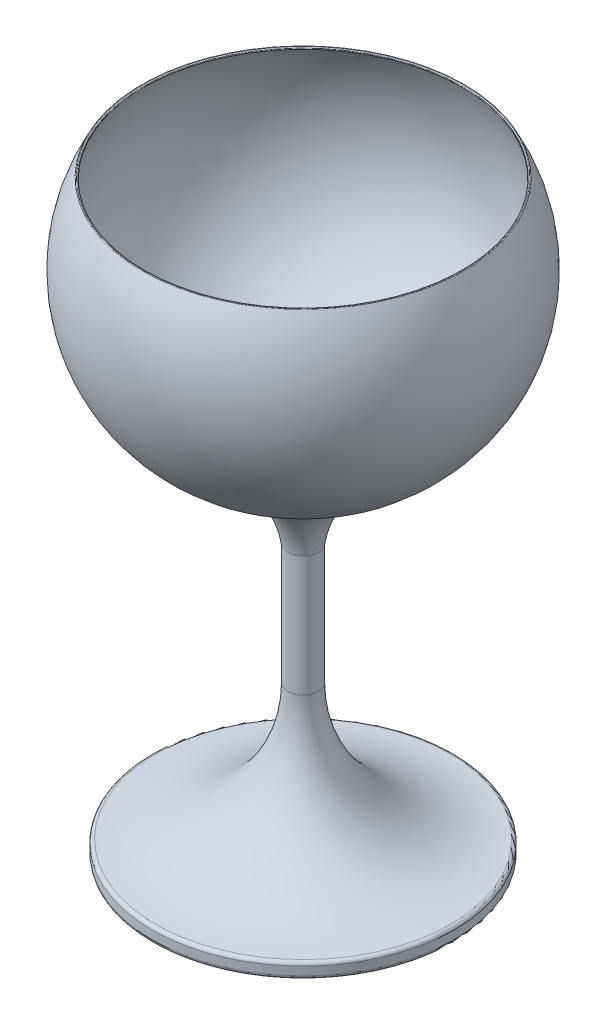
ISO-10303-21;
HEADER;
FILE_DESCRIPTION(('STEP AP214'),'2;1');
FILE_NAME('part.step','',(''),(''),'','','');
FILE_SCHEMA(('AUTOMOTIVE_DESIGN { 1 0 10303 214 1 1 1 1 }'));
ENDSEC;
DATA;
#1=APPLICATION_CONTEXT('core data for automotive mechanical design processes');
#2=APPLICATION_PROTOCOL_DEFINITION('international standard','automotive_design',2000,#1);
#3=PRODUCT_CONTEXT('',#1,'mechanical');
#4=PRODUCT('Part','Part','',(#3));
#5=PRODUCT_RELATED_PRODUCT_CATEGORY('part','',(#4));
#6=PRODUCT_DEFINITION_FORMATION('','',#4);
#7=PRODUCT_DEFINITION_CONTEXT('part definition',#1,'design');
#8=PRODUCT_DEFINITION('design','',#6,#7);
#9=PRODUCT_DEFINITION_SHAPE('','',#8);
#10=(LENGTH_UNIT() NAMED_UNIT(*) SI_UNIT(.MILLI.,.METRE.));
#11=(NAMED_UNIT(*) PLANE_ANGLE_UNIT() SI_UNIT($,.RADIAN.));
#12=(NAMED_UNIT(*) SI_UNIT($,.STERADIAN.) SOLID_ANGLE_UNIT());
#13=UNCERTAINTY_MEASURE_WITH_UNIT(LENGTH_MEASURE(1.E-05),#10,'distance_accuracy_value','');
#14=(GEOMETRIC_REPRESENTATION_CONTEXT(3) GLOBAL_UNCERTAINTY_ASSIGNED_CONTEXT((#13)) GLOBAL_UNIT_ASSIGNED_CONTEXT((#10,
#11,#12)) REPRESENTATION_CONTEXT('',''));
#15=CARTESIAN_POINT('',(0.,0.,0.));
#16=DIRECTION('',(0.,0.,1.));
#17=DIRECTION('',(1.,0.,0.));
#18=AXIS2_PLACEMENT_3D('',#15,#16,#17);
#19=CARTESIAN_POINT('',(0.,-112.912710017662,0.));
#20=DIRECTION('',(0.,-1.,0.));
#21=DIRECTION('',(0.,0.,-1.));
#22=AXIS2_PLACEMENT_3D('',#19,#20,#21);
#23=TOROIDAL_SURFACE('',#22,44.5,40.);
#24=CARTESIAN_POINT('',(0.,-112.912710017662,0.));
#25=DIRECTION('',(0.,-1.,0.));
#26=DIRECTION('',(0.,0.,-1.));
#27=AXIS2_PLACEMENT_3D('',#24,#25,#26);
#28=CIRCLE('',#27,4.5);
#29=CARTESIAN_POINT('',(0.,-112.912710017662,-4.5));
#30=VERTEX_POINT('',#29);
#31=EDGE_CURVE('E11',#30,#30,#28,.T.);
#32=ORIENTED_EDGE('',*,*,#31,.T.);
#33=EDGE_LOOP('',(#32));
#34=FACE_BOUND('',#33,.T.);
#35=CARTESIAN_POINT('',(0.,-152.900810567748,0.));
#36=DIRECTION('',(0.,-1.,0.));
#37=DIRECTION('',(0.,0.,-1.));
#38=AXIS2_PLACEMENT_3D('',#35,#36,#37);
#39=CIRCLE('',#38,43.5243902439024);
#40=CARTESIAN_POINT('',(0.,-152.900810567748,-43.5243902439024));
#41=VERTEX_POINT('',#40);
#42=EDGE_CURVE('E132',#41,#41,#39,.T.);
#43=ORIENTED_EDGE('',*,*,#42,.F.);
#44=EDGE_LOOP('',(#43));
#45=FACE_BOUND('',#44,.T.);
#46=ADVANCED_FACE('F41',(#34,#45),#23,.F.);
#47=CARTESIAN_POINT('',(0.,-162.570284158374,0.));
#48=DIRECTION('',(0.,-1.,0.));
#49=DIRECTION('',(0.,0.,-1.));
#50=AXIS2_PLACEMENT_3D('',#47,#48,#49);
#51=CYLINDRICAL_SURFACE('',#50,4.5);
#52=CARTESIAN_POINT('',(0.,-77.4005130815004,0.));
#53=DIRECTION('',(0.,-1.,0.));
#54=DIRECTION('',(0.,0.,-1.));
#55=AXIS2_PLACEMENT_3D('',#52,#53,#54);
#56=CIRCLE('',#55,4.49999999999999);
#57=CARTESIAN_POINT('',(0.,-77.4005130815004,-4.49999999999999));
#58=VERTEX_POINT('',#57);
#59=EDGE_CURVE('E49',#58,#58,#56,.T.);
#60=ORIENTED_EDGE('',*,*,#59,.T.);
#61=EDGE_LOOP('',(#60));
#62=FACE_BOUND('',#61,.T.);
#63=ORIENTED_EDGE('',*,*,#31,.F.);
#64=EDGE_LOOP('',(#63));
#65=FACE_BOUND('',#64,.T.);
#66=ADVANCED_FACE('F109',(#62,#65),#51,.T.);
#67=CARTESIAN_POINT('',(0.,-81.2935701157988,0.));
#68=DIRECTION('',(0.,-1.,0.));
#69=DIRECTION('',(0.,0.,-1.));
#70=AXIS2_PLACEMENT_3D('',#67,#68,#69);
#71=TOROIDAL_SURFACE('',#70,34.2463293017424,30.);
#72=CARTESIAN_POINT('',(0.,-53.9479445443123,0.));
#73=DIRECTION('',(0.,-1.,0.));
#74=DIRECTION('',(0.,0.,-1.));
#75=AXIS2_PLACEMENT_3D('',#72,#73,#74);
#76=CIRCLE('',#75,21.9087135635188);
#77=CARTESIAN_POINT('',(0.,-53.9479445443123,-21.9087135635188));
#78=VERTEX_POINT('',#77);
#79=EDGE_CURVE('E102',#78,#78,#76,.T.);
#80=ORIENTED_EDGE('',*,*,#79,.T.);
#81=EDGE_LOOP('',(#80));
#82=FACE_BOUND('',#81,.T.);
#83=ORIENTED_EDGE('',*,*,#59,.F.);
#84=EDGE_LOOP('',(#83));
#85=FACE_BOUND('',#84,.T.);
#86=ADVANCED_FACE('F112',(#82,#85),#71,.F.);
#87=CARTESIAN_POINT('',(0.,-53.9479445443123,0.));
#88=DIRECTION('',(0.,1.,0.));
#89=DIRECTION('',(0.,0.,1.));
#90=AXIS2_PLACEMENT_3D('',#87,#88,#89);
#91=CONICAL_SURFACE('',#90,21.9087135635188,1.14696712383149);
#92=CARTESIAN_POINT('',(0.,-52.9765557006446,0.));
#93=DIRECTION('',(0.,-1.,0.));
#94=DIRECTION('',(0.,0.,-1.));
#95=AXIS2_PLACEMENT_3D('',#92,#93,#94);
#96=CIRCLE('',#95,24.0617418444175);
#97=CARTESIAN_POINT('',(0.,-52.9765557006446,-24.0617418444175));
#98=VERTEX_POINT('',#97);
#99=EDGE_CURVE('E98',#98,#98,#96,.T.);
#100=ORIENTED_EDGE('',*,*,#99,.T.);
#101=EDGE_LOOP('',(#100));
#102=FACE_BOUND('',#101,.T.);
#103=ORIENTED_EDGE('',*,*,#79,.F.);
#104=EDGE_LOOP('',(#103));
#105=FACE_BOUND('',#104,.T.);
#106=ADVANCED_FACE('F114',(#102,#105),#91,.T.);
#107=CARTESIAN_POINT('',(0.,-7.40051308150044,0.));
#108=DIRECTION('',(0.,-1.,0.));
#109=DIRECTION('',(0.,0.,-1.));
#110=AXIS2_PLACEMENT_3D('',#107,#108,#109);
#111=DEGENERATE_TOROIDAL_SURFACE('',#110,3.499048947378,50.,.T.);
#112=CARTESIAN_POINT('',(0.,16.1695068084972,0.));
#113=DIRECTION('',(0.,-1.,0.));
#114=DIRECTION('',(0.,0.,-1.));
#115=AXIS2_PLACEMENT_3D('',#112,#113,#114);
#116=CIRCLE('',#115,47.5950143227399);
#117=CARTESIAN_POINT('',(0.,16.1695068084972,-47.5950143227399));
#118=VERTEX_POINT('',#117);
#119=EDGE_CURVE('E94',#118,#118,#116,.T.);
#120=ORIENTED_EDGE('',*,*,#119,.T.);
#121=EDGE_LOOP('',(#120));
#122=FACE_BOUND('',#121,.T.);
#123=ORIENTED_EDGE('',*,*,#99,.F.);
#124=EDGE_LOOP('',(#123));
#125=FACE_BOUND('',#124,.T.);
#126=ADVANCED_FACE('F121',(#122,#125),#111,.T.);
#127=CARTESIAN_POINT('',(0.,16.0752267289372,0.));
#128=DIRECTION('',(0.,-1.,0.));
#129=DIRECTION('',(0.,0.,-1.));
#130=AXIS2_PLACEMENT_3D('',#127,#128,#129);
#131=TOROIDAL_SURFACE('',#130,47.4186304612385,0.200000000000005);
#132=CARTESIAN_POINT('',(0.,16.2512305331477,0.));
#133=DIRECTION('',(0.,-1.,0.));
#134=DIRECTION('',(0.,0.,-1.));
#135=AXIS2_PLACEMENT_3D('',#132,#133,#134);
#136=CIRCLE('',#135,47.3236427730708);
#137=CARTESIAN_POINT('',(0.,16.2512305331477,-47.3236427730708));
#138=VERTEX_POINT('',#137);
#139=EDGE_CURVE('E90',#138,#138,#136,.T.);
#140=ORIENTED_EDGE('',*,*,#139,.T.);
#141=EDGE_LOOP('',(#140));
#142=FACE_BOUND('',#141,.T.);
#143=ORIENTED_EDGE('',*,*,#119,.F.);
#144=EDGE_LOOP('',(#143));
#145=FACE_BOUND('',#144,.T.);
#146=ADVANCED_FACE('F190',(#142,#145),#131,.T.);
#147=CARTESIAN_POINT('',(0.,16.2512305331477,0.));
#148=DIRECTION('',(0.,1.,0.));
#149=DIRECTION('',(0.,0.,1.));
#150=AXIS2_PLACEMENT_3D('',#147,#148,#149);
#151=CONICAL_SURFACE('',#150,47.3236427730708,1.07590224847942);
#152=CARTESIAN_POINT('',(0.,16.0850007288194,0.));
#153=DIRECTION('',(0.,-1.,0.));
#154=DIRECTION('',(0.,0.,-1.));
#155=AXIS2_PLACEMENT_3D('',#152,#153,#154);
#156=CIRCLE('',#155,47.0156336142068);
#157=CARTESIAN_POINT('',(0.,16.0850007288194,-47.0156336142068));
#158=VERTEX_POINT('',#157);
#159=EDGE_CURVE('E86',#158,#158,#156,.T.);
#160=ORIENTED_EDGE('',*,*,#159,.T.);
#161=EDGE_LOOP('',(#160));
#162=FACE_BOUND('',#161,.T.);
#163=ORIENTED_EDGE('',*,*,#139,.F.);
#164=EDGE_LOOP('',(#163));
#165=FACE_BOUND('',#164,.T.);
#166=ADVANCED_FACE('F186',(#162,#165),#151,.F.);
#167=CARTESIAN_POINT('',(0.,15.9089969246089,0.));
#168=DIRECTION('',(0.,-1.,0.));
#169=DIRECTION('',(0.,0.,-1.));
#170=AXIS2_PLACEMENT_3D('',#167,#168,#169);
#171=TOROIDAL_SURFACE('',#170,47.1106213023745,0.200000000000004);
#172=CARTESIAN_POINT('',(0.,15.8147218588612,0.));
#173=DIRECTION('',(0.,-1.,0.));
#174=DIRECTION('',(0.,0.,-1.));
#175=AXIS2_PLACEMENT_3D('',#172,#173,#174);
#176=CIRCLE('',#175,46.9342347609994);
#177=CARTESIAN_POINT('',(0.,15.8147218588612,-46.9342347609994));
#178=VERTEX_POINT('',#177);
#179=EDGE_CURVE('E82',#178,#178,#176,.T.);
#180=ORIENTED_EDGE('',*,*,#179,.T.);
#181=EDGE_LOOP('',(#180));
#182=FACE_BOUND('',#181,.T.);
#183=ORIENTED_EDGE('',*,*,#159,.F.);
#184=EDGE_LOOP('',(#183));
#185=FACE_BOUND('',#184,.T.);
#186=ADVANCED_FACE('F182',(#182,#185),#171,.T.);
#187=CARTESIAN_POINT('',(0.,-7.40051308150044,0.));
#188=DIRECTION('',(0.,-1.,0.));
#189=DIRECTION('',(0.,0.,-1.));
#190=AXIS2_PLACEMENT_3D('',#187,#188,#189);
#191=DEGENERATE_TOROIDAL_SURFACE('',#190,3.499048947378,49.25,.T.);
#192=CARTESIAN_POINT('',(0.,-52.2929150613574,0.));
#193=DIRECTION('',(0.,-1.,0.));
#194=DIRECTION('',(0.,0.,-1.));
#195=AXIS2_PLACEMENT_3D('',#192,#193,#194);
#196=CIRCLE('',#195,23.7533014509619);
#197=CARTESIAN_POINT('',(0.,-52.2929150613574,-23.7533014509619));
#198=VERTEX_POINT('',#197);
#199=EDGE_CURVE('E72',#198,#198,#196,.T.);
#200=ORIENTED_EDGE('',*,*,#199,.T.);
#201=EDGE_LOOP('',(#200));
#202=FACE_BOUND('',#201,.T.);
#203=ORIENTED_EDGE('',*,*,#179,.F.);
#204=EDGE_LOOP('',(#203));
#205=FACE_BOUND('',#204,.T.);
#206=ADVANCED_FACE('F178',(#202,#205),#191,.F.);
#207=CARTESIAN_POINT('',(0.,-52.2929150613574,0.));
#208=DIRECTION('',(0.,1.,0.));
#209=DIRECTION('',(0.,0.,1.));
#210=AXIS2_PLACEMENT_3D('',#207,#208,#209);
#211=CONICAL_SURFACE('',#210,23.7533014509619,1.1469671238315);
#212=CARTESIAN_POINT('',(0.,-54.19085181621,0.));
#213=DIRECTION('',(0.,-1.,0.));
#214=DIRECTION('',(0.,0.,-1.));
#215=AXIS2_PLACEMENT_3D('',#212,#213,#214);
#216=CIRCLE('',#215,19.5466322729159);
#217=CARTESIAN_POINT('',(0.,-54.19085181621,-19.5466322729159));
#218=VERTEX_POINT('',#217);
#219=EDGE_CURVE('E66',#218,#218,#216,.T.);
#220=ORIENTED_EDGE('',*,*,#219,.T.);
#221=EDGE_LOOP('',(#220));
#222=FACE_BOUND('',#221,.T.);
#223=ORIENTED_EDGE('',*,*,#199,.F.);
#224=EDGE_LOOP('',(#223));
#225=FACE_BOUND('',#224,.T.);
#226=ADVANCED_FACE('F175',(#222,#225),#211,.F.);
#227=CARTESIAN_POINT('',(0.,-49.6332475542956,0.));
#228=DIRECTION('',(0.,-1.,0.));
#229=DIRECTION('',(0.,0.,-1.));
#230=AXIS2_PLACEMENT_3D('',#227,#228,#229);
#231=TOROIDAL_SURFACE('',#230,17.4903629832119,4.99999999999997);
#232=CARTESIAN_POINT('',(0.,-54.5333684649435,0.));
#233=DIRECTION('',(0.,-1.,0.));
#234=DIRECTION('',(0.,0.,-1.));
#235=AXIS2_PLACEMENT_3D('',#232,#233,#234);
#236=CIRCLE('',#235,18.4847547877995);
#237=CARTESIAN_POINT('',(0.,-54.5333684649435,-18.4847547877995));
#238=VERTEX_POINT('',#237);
#239=EDGE_CURVE('E63',#238,#238,#236,.T.);
#240=ORIENTED_EDGE('',*,*,#239,.T.);
#241=EDGE_LOOP('',(#240));
#242=FACE_BOUND('',#241,.T.);
#243=ORIENTED_EDGE('',*,*,#219,.F.);
#244=EDGE_LOOP('',(#243));
#245=FACE_BOUND('',#244,.T.);
#246=ADVANCED_FACE('F59',(#242,#245),#231,.F.);
#247=CARTESIAN_POINT('',(0.,239.473886173932,41.1787534874532));
#248=DIRECTION('',(-1.,0.,0.));
#249=DIRECTION('',(0.,0.,-1.));
#250=AXIS2_PLACEMENT_3D('',#247,#248,#249);
#251=CIRCLE('',#250,300.);
#252=TRIMMED_CURVE('',#251,(PARAMETER_VALUE(-1.43309909211471)),
(PARAMETER_VALUE(1.43309909211471)),.T.,.PARAMETER.);
#253=CARTESIAN_POINT('',(0.,239.473886173932,0.));
#254=DIRECTION('',(0.,-1.,0.));
#255=AXIS1_PLACEMENT('',#253,#254);
#256=SURFACE_OF_REVOLUTION('',#252,#255);
#257=CARTESIAN_POINT('',(-1.52655665885959E-13,-57.6865254915846,0.));
#258=VERTEX_POINT('',#257);
#259=VERTEX_LOOP('',#258);
#260=FACE_BOUND('',#259,.T.);
#261=ORIENTED_EDGE('',*,*,#239,.F.);
#262=EDGE_LOOP('',(#261));
#263=FACE_BOUND('',#262,.T.);
#264=ADVANCED_FACE('F55',(#260,#263),#256,.F.);
#265=CARTESIAN_POINT('',(0.,-353.237532739027,8.0725197055923));
#266=DIRECTION('',(-1.,0.,0.));
#267=DIRECTION('',(0.,0.,-1.));
#268=AXIS2_PLACEMENT_3D('',#265,#266,#267);
#269=CIRCLE('',#268,200.);
#270=TRIMMED_CURVE('',#269,(PARAMETER_VALUE(-1.53042276084168)),
(PARAMETER_VALUE(1.53042276084168)),.T.,.PARAMETER.);
#271=CARTESIAN_POINT('',(0.,-353.237532739027,0.));
#272=DIRECTION('',(0.,-1.,0.));
#273=AXIS1_PLACEMENT('',#271,#272);
#274=SURFACE_OF_REVOLUTION('',#270,#273);
#275=CARTESIAN_POINT('',(0.,-157.298976975586,0.));
#276=DIRECTION('',(0.,-1.,0.));
#277=DIRECTION('',(0.,0.,-1.));
#278=AXIS2_PLACEMENT_3D('',#275,#276,#277);
#279=CIRCLE('',#278,32.0283825951905);
#280=CARTESIAN_POINT('',(0.,-157.298976975586,-32.0283825951905));
#281=VERTEX_POINT('',#280);
#282=EDGE_CURVE('E67',#281,#281,#279,.T.);
#283=ORIENTED_EDGE('',*,*,#282,.T.);
#284=EDGE_LOOP('',(#283));
#285=FACE_BOUND('',#284,.T.);
#286=CARTESIAN_POINT('',(0.,-153.4005130815,0.));
#287=VERTEX_POINT('',#286);
#288=VERTEX_LOOP('',#287);
#289=FACE_BOUND('',#288,.T.);
#290=ADVANCED_FACE('F58',(#285,#289),#274,.F.);
#291=CARTESIAN_POINT('',(0.,-152.4005130815,0.));
#292=DIRECTION('',(0.,-1.,0.));
#293=DIRECTION('',(0.,0.,-1.));
#294=AXIS2_PLACEMENT_3D('',#291,#292,#293);
#295=TOROIDAL_SURFACE('',#294,33.0309051527101,5.00000000000001);
#296=CARTESIAN_POINT('',(0.,-157.4005130815,0.));
#297=DIRECTION('',(0.,-1.,0.));
#298=DIRECTION('',(0.,0.,-1.));
#299=AXIS2_PLACEMENT_3D('',#296,#297,#298);
#300=CIRCLE('',#299,33.0309051527101);
#301=CARTESIAN_POINT('',(0.,-157.4005130815,-33.0309051527101));
#302=VERTEX_POINT('',#301);
#303=EDGE_CURVE('E75',#302,#302,#300,.T.);
#304=ORIENTED_EDGE('',*,*,#303,.T.);
#305=EDGE_LOOP('',(#304));
#306=FACE_BOUND('',#305,.T.);
#307=ORIENTED_EDGE('',*,*,#282,.F.);
#308=EDGE_LOOP('',(#307));
#309=FACE_BOUND('',#308,.T.);
#310=ADVANCED_FACE('F152',(#306,#309),#295,.T.);
#311=CARTESIAN_POINT('',(43.5,-157.4005130815,0.));
#312=DIRECTION('',(0.,-1.,0.));
#313=DIRECTION('',(0.,0.,-1.));
#314=AXIS2_PLACEMENT_3D('',#311,#312,#313);
#315=PLANE('',#314);
#316=CARTESIAN_POINT('',(0.,-157.4005130815,0.));
#317=DIRECTION('',(0.,-1.,0.));
#318=DIRECTION('',(0.,0.,-1.));
#319=AXIS2_PLACEMENT_3D('',#316,#317,#318);
#320=CIRCLE('',#319,43.5);
#321=CARTESIAN_POINT('',(0.,-157.4005130815,-43.5));
#322=VERTEX_POINT('',#321);
#323=EDGE_CURVE('E145',#322,#322,#320,.T.);
#324=ORIENTED_EDGE('',*,*,#323,.T.);
#325=EDGE_LOOP('',(#324));
#326=FACE_BOUND('',#325,.T.);
#327=ORIENTED_EDGE('',*,*,#303,.F.);
#328=EDGE_LOOP('',(#327));
#329=FACE_BOUND('',#328,.T.);
#330=ADVANCED_FACE('F155',(#326,#329),#315,.T.);
#331=CARTESIAN_POINT('',(0.,-156.4005130815,0.));
#332=DIRECTION('',(0.,-1.,0.));
#333=DIRECTION('',(0.,0.,-1.));
#334=AXIS2_PLACEMENT_3D('',#331,#332,#333);
#335=TOROIDAL_SURFACE('',#334,43.5,1.);
#336=CARTESIAN_POINT('',(0.,-156.4005130815,0.));
#337=DIRECTION('',(0.,-1.,0.));
#338=DIRECTION('',(0.,0.,-1.));
#339=AXIS2_PLACEMENT_3D('',#336,#337,#338);
#340=CIRCLE('',#339,44.5);
#341=CARTESIAN_POINT('',(0.,-156.4005130815,-44.5));
#342=VERTEX_POINT('',#341);
#343=EDGE_CURVE('E139',#342,#342,#340,.T.);
#344=ORIENTED_EDGE('',*,*,#343,.T.);
#345=EDGE_LOOP('',(#344));
#346=FACE_BOUND('',#345,.T.);
#347=ORIENTED_EDGE('',*,*,#323,.F.);
#348=EDGE_LOOP('',(#347));
#349=FACE_BOUND('',#348,.T.);
#350=ADVANCED_FACE('F157',(#346,#349),#335,.T.);
#351=CARTESIAN_POINT('',(0.,-162.570284158374,0.));
#352=DIRECTION('',(0.,-1.,0.));
#353=DIRECTION('',(0.,0.,-1.));
#354=AXIS2_PLACEMENT_3D('',#351,#352,#353);
#355=CYLINDRICAL_SURFACE('',#354,44.5);
#356=CARTESIAN_POINT('',(0.,-153.9005130815,0.));
#357=DIRECTION('',(0.,-1.,0.));
#358=DIRECTION('',(0.,0.,-1.));
#359=AXIS2_PLACEMENT_3D('',#356,#357,#358);
#360=CIRCLE('',#359,44.5);
#361=CARTESIAN_POINT('',(0.,-153.9005130815,-44.5));
#362=VERTEX_POINT('',#361);
#363=EDGE_CURVE('E135',#362,#362,#360,.T.);
#364=ORIENTED_EDGE('',*,*,#363,.T.);
#365=EDGE_LOOP('',(#364));
#366=FACE_BOUND('',#365,.T.);
#367=ORIENTED_EDGE('',*,*,#343,.F.);
#368=EDGE_LOOP('',(#367));
#369=FACE_BOUND('',#368,.T.);
#370=ADVANCED_FACE('F164',(#366,#369),#355,.T.);
#371=CARTESIAN_POINT('',(0.,-153.9005130815,0.));
#372=DIRECTION('',(0.,-1.,0.));
#373=DIRECTION('',(0.,0.,-1.));
#374=AXIS2_PLACEMENT_3D('',#371,#372,#373);
#375=TOROIDAL_SURFACE('',#374,43.5,1.00000000000001);
#376=ORIENTED_EDGE('',*,*,#42,.T.);
#377=EDGE_LOOP('',(#376));
#378=FACE_BOUND('',#377,.T.);
#379=ORIENTED_EDGE('',*,*,#363,.F.);
#380=EDGE_LOOP('',(#379));
#381=FACE_BOUND('',#380,.T.);
#382=ADVANCED_FACE('F262',(#378,#381),#375,.T.);
#383=CLOSED_SHELL('',(#46,#66,#86,#106,#126,#146,#166,#186,#206,#226,#246,#264,#290,#310,#330,
#350,#370,#382));
#384=MANIFOLD_SOLID_BREP('B2',#383);
#385=ADVANCED_BREP_SHAPE_REPRESENTATION('',(#18,#384),#14);
#386=SHAPE_DEFINITION_REPRESENTATION(#9,#385);
ENDSEC;
END-ISO-10303-21;
